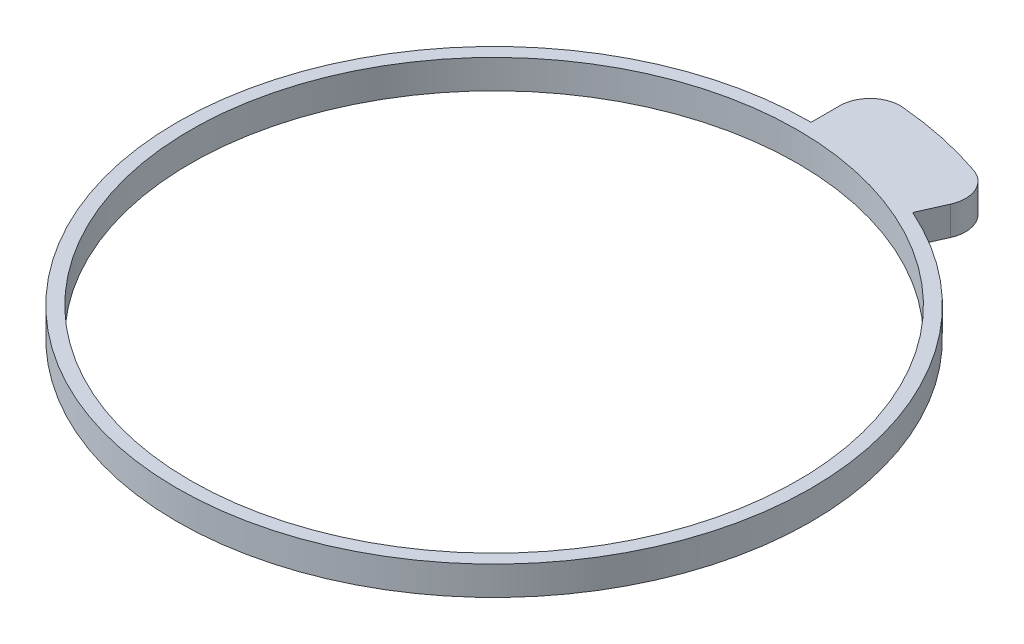
ISO-10303-21;
HEADER;
FILE_DESCRIPTION(('STEP AP214'),'2;1');
FILE_NAME('part.step','',(''),(''),'','','');
FILE_SCHEMA(('AUTOMOTIVE_DESIGN { 1 0 10303 214 1 1 1 1 }'));
ENDSEC;
DATA;
#1=APPLICATION_CONTEXT('core data for automotive mechanical design processes');
#2=APPLICATION_PROTOCOL_DEFINITION('international standard','automotive_design',2000,#1);
#3=PRODUCT_CONTEXT('',#1,'mechanical');
#4=PRODUCT('Part','Part','',(#3));
#5=PRODUCT_RELATED_PRODUCT_CATEGORY('part','',(#4));
#6=PRODUCT_DEFINITION_FORMATION('','',#4);
#7=PRODUCT_DEFINITION_CONTEXT('part definition',#1,'design');
#8=PRODUCT_DEFINITION('design','',#6,#7);
#9=PRODUCT_DEFINITION_SHAPE('','',#8);
#10=(LENGTH_UNIT() NAMED_UNIT(*) SI_UNIT(.MILLI.,.METRE.));
#11=(NAMED_UNIT(*) PLANE_ANGLE_UNIT() SI_UNIT($,.RADIAN.));
#12=(NAMED_UNIT(*) SI_UNIT($,.STERADIAN.) SOLID_ANGLE_UNIT());
#13=UNCERTAINTY_MEASURE_WITH_UNIT(LENGTH_MEASURE(1.E-05),#10,'distance_accuracy_value','');
#14=(GEOMETRIC_REPRESENTATION_CONTEXT(3) GLOBAL_UNCERTAINTY_ASSIGNED_CONTEXT((#13)) GLOBAL_UNIT_ASSIGNED_CONTEXT((#10,
#11,#12)) REPRESENTATION_CONTEXT('',''));
#15=CARTESIAN_POINT('',(0.,0.,0.));
#16=DIRECTION('',(0.,0.,1.));
#17=DIRECTION('',(1.,0.,0.));
#18=AXIS2_PLACEMENT_3D('',#15,#16,#17);
#19=CARTESIAN_POINT('',(0.,9.6,0.));
#20=DIRECTION('',(0.,-1.,0.));
#21=DIRECTION('',(0.,0.,-1.));
#22=AXIS2_PLACEMENT_3D('',#19,#20,#21);
#23=CYLINDRICAL_SURFACE('',#22,105.25);
#24=DIRECTION('',(0.,-1.,0.));
#25=VECTOR('',#24,1.);
#26=CARTESIAN_POINT('',(42.8090316837281,0.,-96.1506594168837));
#27=LINE('',#26,#25);
#28=CARTESIAN_POINT('',(42.8090316837281,9.6,-96.1506594168837));
#29=VERTEX_POINT('',#28);
#30=CARTESIAN_POINT('',(42.8090316837281,0.,-96.1506594168837));
#31=VERTEX_POINT('',#30);
#32=EDGE_CURVE('E112',#29,#31,#27,.T.);
#33=ORIENTED_EDGE('',*,*,#32,.F.);
#34=CARTESIAN_POINT('',(0.,9.6,0.));
#35=DIRECTION('',(0.,1.,0.));
#36=DIRECTION('',(0.,0.,1.));
#37=AXIS2_PLACEMENT_3D('',#34,#35,#36);
#38=CIRCLE('',#37,105.25);
#39=CARTESIAN_POINT('',(0.,9.6,-105.25));
#40=VERTEX_POINT('',#39);
#41=EDGE_CURVE('E109',#40,#29,#38,.T.);
#42=ORIENTED_EDGE('',*,*,#41,.F.);
#43=DIRECTION('',(0.,-1.,0.));
#44=VECTOR('',#43,1.);
#45=CARTESIAN_POINT('',(0.,0.,-105.25));
#46=LINE('',#45,#44);
#47=CARTESIAN_POINT('',(0.,0.,-105.25));
#48=VERTEX_POINT('',#47);
#49=EDGE_CURVE('E116',#40,#48,#46,.T.);
#50=ORIENTED_EDGE('',*,*,#49,.T.);
#51=CARTESIAN_POINT('',(0.,0.,0.));
#52=DIRECTION('',(0.,1.,0.));
#53=DIRECTION('',(0.,0.,1.));
#54=AXIS2_PLACEMENT_3D('',#51,#52,#53);
#55=CIRCLE('',#54,105.25);
#56=EDGE_CURVE('E127',#48,#31,#55,.T.);
#57=ORIENTED_EDGE('',*,*,#56,.T.);
#58=EDGE_LOOP('',(#33,#42,#50,#57));
#59=FACE_BOUND('',#58,.T.);
#60=ADVANCED_FACE('F47',(#59),#23,.T.);
#61=CARTESIAN_POINT('',(0.,9.6,0.));
#62=DIRECTION('',(0.,1.,0.));
#63=DIRECTION('',(0.,0.,1.));
#64=AXIS2_PLACEMENT_3D('',#61,#62,#63);
#65=PLANE('',#64);
#66=CARTESIAN_POINT('',(0.,9.6,0.));
#67=DIRECTION('',(0.,1.,0.));
#68=DIRECTION('',(0.,0.,1.));
#69=AXIS2_PLACEMENT_3D('',#66,#67,#68);
#70=CIRCLE('',#69,125.25);
#71=CARTESIAN_POINT('',(40.8235141515557,9.6,-118.410317085623));
#72=VERTEX_POINT('',#71);
#73=CARTESIAN_POINT('',(10.8676789587852,9.6,-124.777626416152));
#74=VERTEX_POINT('',#73);
#75=EDGE_CURVE('E163',#72,#74,#70,.T.);
#76=ORIENTED_EDGE('',*,*,#75,.T.);
#77=CARTESIAN_POINT('',(10.,9.6,-114.815340873944));
#78=DIRECTION('',(0.,1.,0.));
#79=DIRECTION('',(0.,0.,1.));
#80=AXIS2_PLACEMENT_3D('',#77,#78,#79);
#81=CIRCLE('',#80,10.);
#82=CARTESIAN_POINT('',(0.,9.6,-114.815340873944));
#83=VERTEX_POINT('',#82);
#84=EDGE_CURVE('E110',#74,#83,#81,.T.);
#85=ORIENTED_EDGE('',*,*,#84,.T.);
#86=DIRECTION('',(0.,0.,1.));
#87=VECTOR('',#86,1.);
#88=CARTESIAN_POINT('',(0.,9.6,-105.25));
#89=LINE('',#88,#87);
#90=EDGE_CURVE('E102',#83,#40,#89,.T.);
#91=ORIENTED_EDGE('',*,*,#90,.T.);
#92=ORIENTED_EDGE('',*,*,#41,.T.);
#93=DIRECTION('',(-0.406736643075801,0.,0.913545457642601));
#94=VECTOR('',#93,1.);
#95=CARTESIAN_POINT('',(42.8090316837281,9.6,-96.1506594168837));
#96=LINE('',#95,#94);
#97=CARTESIAN_POINT('',(46.6996063206719,9.6,-104.889033123079));
#98=VERTEX_POINT('',#97);
#99=EDGE_CURVE('E164',#98,#29,#96,.T.);
#100=ORIENTED_EDGE('',*,*,#99,.F.);
#101=CARTESIAN_POINT('',(37.5641517442459,9.6,-108.956399553837));
#102=DIRECTION('',(0.,1.,0.));
#103=DIRECTION('',(0.,0.,1.));
#104=AXIS2_PLACEMENT_3D('',#101,#102,#103);
#105=CIRCLE('',#104,10.);
#106=EDGE_CURVE('E142',#98,#72,#105,.T.);
#107=ORIENTED_EDGE('',*,*,#106,.T.);
#108=EDGE_LOOP('',(#76,#85,#91,#92,#100,#107));
#109=FACE_BOUND('',#108,.T.);
#110=CARTESIAN_POINT('',(0.,9.6,0.));
#111=DIRECTION('',(0.,1.,0.));
#112=DIRECTION('',(0.,0.,1.));
#113=AXIS2_PLACEMENT_3D('',#110,#111,#112);
#114=CIRCLE('',#113,100.8);
#115=CARTESIAN_POINT('',(0.,9.6,100.8));
#116=VERTEX_POINT('',#115);
#117=EDGE_CURVE('E133',#116,#116,#114,.T.);
#118=ORIENTED_EDGE('',*,*,#117,.F.);
#119=EDGE_LOOP('',(#118));
#120=FACE_BOUND('',#119,.T.);
#121=ADVANCED_FACE('F105',(#109,#120),#65,.T.);
#122=CARTESIAN_POINT('',(0.,0.,0.));
#123=DIRECTION('',(0.,1.,0.));
#124=DIRECTION('',(0.,0.,1.));
#125=AXIS2_PLACEMENT_3D('',#122,#123,#124);
#126=PLANE('',#125);
#127=DIRECTION('',(0.,0.,-1.));
#128=VECTOR('',#127,1.);
#129=CARTESIAN_POINT('',(0.,0.,-105.25));
#130=LINE('',#129,#128);
#131=CARTESIAN_POINT('',(0.,0.,-114.815340873944));
#132=VERTEX_POINT('',#131);
#133=EDGE_CURVE('E113',#48,#132,#130,.T.);
#134=ORIENTED_EDGE('',*,*,#133,.T.);
#135=CARTESIAN_POINT('',(10.,0.,-114.815340873944));
#136=DIRECTION('',(0.,1.,0.));
#137=DIRECTION('',(0.,0.,1.));
#138=AXIS2_PLACEMENT_3D('',#135,#136,#137);
#139=CIRCLE('',#138,10.);
#140=CARTESIAN_POINT('',(10.8676789587852,0.,-124.777626416152));
#141=VERTEX_POINT('',#140);
#142=EDGE_CURVE('E56',#132,#141,#139,.F.);
#143=ORIENTED_EDGE('',*,*,#142,.T.);
#144=CARTESIAN_POINT('',(0.,0.,0.));
#145=DIRECTION('',(0.,1.,0.));
#146=DIRECTION('',(0.,0.,1.));
#147=AXIS2_PLACEMENT_3D('',#144,#145,#146);
#148=CIRCLE('',#147,125.25);
#149=CARTESIAN_POINT('',(40.8235141515557,0.,-118.410317085623));
#150=VERTEX_POINT('',#149);
#151=EDGE_CURVE('E155',#150,#141,#148,.T.);
#152=ORIENTED_EDGE('',*,*,#151,.F.);
#153=CARTESIAN_POINT('',(37.5641517442459,0.,-108.956399553837));
#154=DIRECTION('',(0.,1.,0.));
#155=DIRECTION('',(0.,0.,1.));
#156=AXIS2_PLACEMENT_3D('',#153,#154,#155);
#157=CIRCLE('',#156,10.);
#158=CARTESIAN_POINT('',(46.6996063206719,0.,-104.889033123079));
#159=VERTEX_POINT('',#158);
#160=EDGE_CURVE('E63',#150,#159,#157,.F.);
#161=ORIENTED_EDGE('',*,*,#160,.T.);
#162=DIRECTION('',(0.406736643075801,0.,-0.913545457642601));
#163=VECTOR('',#162,1.);
#164=CARTESIAN_POINT('',(42.8090316837281,0.,-96.1506594168837));
#165=LINE('',#164,#163);
#166=EDGE_CURVE('E194',#31,#159,#165,.T.);
#167=ORIENTED_EDGE('',*,*,#166,.F.);
#168=ORIENTED_EDGE('',*,*,#56,.F.);
#169=EDGE_LOOP('',(#134,#143,#152,#161,#167,#168));
#170=FACE_BOUND('',#169,.T.);
#171=CARTESIAN_POINT('',(0.,0.,0.));
#172=DIRECTION('',(0.,1.,0.));
#173=DIRECTION('',(0.,0.,1.));
#174=AXIS2_PLACEMENT_3D('',#171,#172,#173);
#175=CIRCLE('',#174,100.8);
#176=CARTESIAN_POINT('',(0.,0.,100.8));
#177=VERTEX_POINT('',#176);
#178=EDGE_CURVE('E136',#177,#177,#175,.T.);
#179=ORIENTED_EDGE('',*,*,#178,.T.);
#180=EDGE_LOOP('',(#179));
#181=FACE_BOUND('',#180,.T.);
#182=ADVANCED_FACE('F153',(#170,#181),#126,.F.);
#183=CARTESIAN_POINT('',(0.,9.6,0.));
#184=DIRECTION('',(0.,-1.,0.));
#185=DIRECTION('',(0.,0.,-1.));
#186=AXIS2_PLACEMENT_3D('',#183,#184,#185);
#187=CYLINDRICAL_SURFACE('',#186,100.8);
#188=ORIENTED_EDGE('',*,*,#117,.T.);
#189=EDGE_LOOP('',(#188));
#190=FACE_BOUND('',#189,.T.);
#191=ORIENTED_EDGE('',*,*,#178,.F.);
#192=EDGE_LOOP('',(#191));
#193=FACE_BOUND('',#192,.T.);
#194=ADVANCED_FACE('F183',(#190,#193),#187,.F.);
#195=CARTESIAN_POINT('',(0.,9.6,0.));
#196=DIRECTION('',(0.,1.,0.));
#197=DIRECTION('',(0.,0.,1.));
#198=AXIS2_PLACEMENT_3D('',#195,#196,#197);
#199=CYLINDRICAL_SURFACE('',#198,125.25);
#200=ORIENTED_EDGE('',*,*,#151,.T.);
#201=DIRECTION('',(0.,1.,0.));
#202=VECTOR('',#201,1.);
#203=CARTESIAN_POINT('',(10.8676789587852,9.6,-124.777626416152));
#204=LINE('',#203,#202);
#205=EDGE_CURVE('E131',#141,#74,#204,.T.);
#206=ORIENTED_EDGE('',*,*,#205,.T.);
#207=ORIENTED_EDGE('',*,*,#75,.F.);
#208=DIRECTION('',(0.,1.,0.));
#209=VECTOR('',#208,1.);
#210=CARTESIAN_POINT('',(40.8235141515557,9.6,-118.410317085623));
#211=LINE('',#210,#209);
#212=EDGE_CURVE('E126',#72,#150,#211,.F.);
#213=ORIENTED_EDGE('',*,*,#212,.T.);
#214=EDGE_LOOP('',(#200,#206,#207,#213));
#215=FACE_BOUND('',#214,.T.);
#216=ADVANCED_FACE('F159',(#215),#199,.T.);
#217=CARTESIAN_POINT('',(0.,0.,0.));
#218=DIRECTION('',(-0.913545457642601,0.,-0.406736643075801));
#219=DIRECTION('',(-0.406736643075801,0.,0.913545457642601));
#220=AXIS2_PLACEMENT_3D('',#217,#218,#219);
#221=PLANE('',#220);
#222=ORIENTED_EDGE('',*,*,#166,.T.);
#223=DIRECTION('',(0.,1.,0.));
#224=VECTOR('',#223,1.);
#225=CARTESIAN_POINT('',(46.6996063206719,0.,-104.889033123079));
#226=LINE('',#225,#224);
#227=EDGE_CURVE('E11',#159,#98,#226,.T.);
#228=ORIENTED_EDGE('',*,*,#227,.T.);
#229=ORIENTED_EDGE('',*,*,#99,.T.);
#230=ORIENTED_EDGE('',*,*,#32,.T.);
#231=EDGE_LOOP('',(#222,#228,#229,#230));
#232=FACE_BOUND('',#231,.T.);
#233=ADVANCED_FACE('F173',(#232),#221,.F.);
#234=CARTESIAN_POINT('',(0.,0.,0.));
#235=DIRECTION('',(-1.,0.,0.));
#236=DIRECTION('',(0.,0.,1.));
#237=AXIS2_PLACEMENT_3D('',#234,#235,#236);
#238=PLANE('',#237);
#239=ORIENTED_EDGE('',*,*,#90,.F.);
#240=DIRECTION('',(0.,-1.,0.));
#241=VECTOR('',#240,1.);
#242=CARTESIAN_POINT('',(0.,0.,-114.815340873944));
#243=LINE('',#242,#241);
#244=EDGE_CURVE('E71',#83,#132,#243,.T.);
#245=ORIENTED_EDGE('',*,*,#244,.T.);
#246=ORIENTED_EDGE('',*,*,#133,.F.);
#247=ORIENTED_EDGE('',*,*,#49,.F.);
#248=EDGE_LOOP('',(#239,#245,#246,#247));
#249=FACE_BOUND('',#248,.T.);
#250=ADVANCED_FACE('F117',(#249),#238,.T.);
#251=CARTESIAN_POINT('',(10.,9.6,-114.815340873944));
#252=DIRECTION('',(0.,1.,0.));
#253=DIRECTION('',(0.,0.,1.));
#254=AXIS2_PLACEMENT_3D('',#251,#252,#253);
#255=CYLINDRICAL_SURFACE('',#254,10.);
#256=ORIENTED_EDGE('',*,*,#142,.F.);
#257=ORIENTED_EDGE('',*,*,#244,.F.);
#258=ORIENTED_EDGE('',*,*,#84,.F.);
#259=ORIENTED_EDGE('',*,*,#205,.F.);
#260=EDGE_LOOP('',(#256,#257,#258,#259));
#261=FACE_BOUND('',#260,.T.);
#262=ADVANCED_FACE('F166',(#261),#255,.T.);
#263=CARTESIAN_POINT('',(37.5641517442459,9.6,-108.956399553837));
#264=DIRECTION('',(0.,1.,0.));
#265=DIRECTION('',(0.,0.,1.));
#266=AXIS2_PLACEMENT_3D('',#263,#264,#265);
#267=CYLINDRICAL_SURFACE('',#266,10.);
#268=ORIENTED_EDGE('',*,*,#160,.F.);
#269=ORIENTED_EDGE('',*,*,#212,.F.);
#270=ORIENTED_EDGE('',*,*,#106,.F.);
#271=ORIENTED_EDGE('',*,*,#227,.F.);
#272=EDGE_LOOP('',(#268,#269,#270,#271));
#273=FACE_BOUND('',#272,.T.);
#274=ADVANCED_FACE('F49',(#273),#267,.T.);
#275=CLOSED_SHELL('',(#60,#121,#182,#194,#216,#233,#250,#262,#274));
#276=MANIFOLD_SOLID_BREP('B2',#275);
#277=ADVANCED_BREP_SHAPE_REPRESENTATION('',(#18,#276),#14);
#278=SHAPE_DEFINITION_REPRESENTATION(#9,#277);
ENDSEC;
END-ISO-10303-21;
